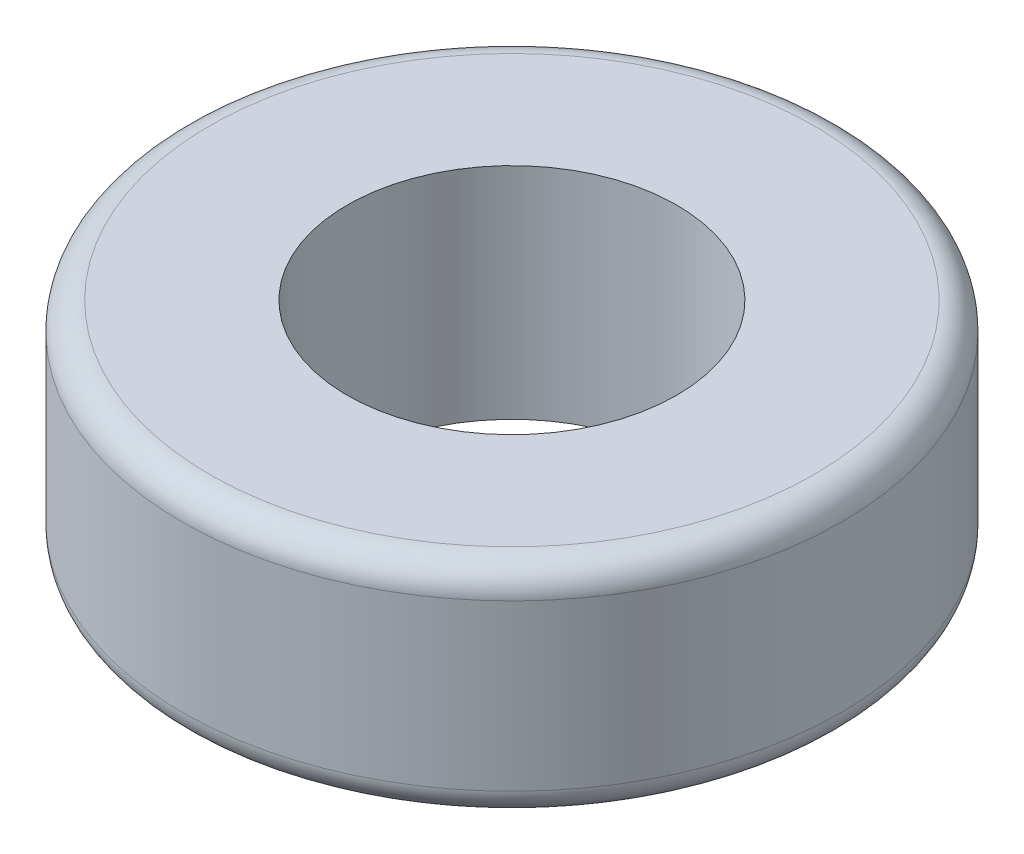
ISO-10303-21;
HEADER;
FILE_DESCRIPTION(('STEP AP214'),'2;1');
FILE_NAME('part.step','',(''),(''),'','','');
FILE_SCHEMA(('AUTOMOTIVE_DESIGN { 1 0 10303 214 1 1 1 1 }'));
ENDSEC;
DATA;
#1=APPLICATION_CONTEXT('core data for automotive mechanical design processes');
#2=APPLICATION_PROTOCOL_DEFINITION('international standard','automotive_design',2000,#1);
#3=PRODUCT_CONTEXT('',#1,'mechanical');
#4=PRODUCT('Part','Part','',(#3));
#5=PRODUCT_RELATED_PRODUCT_CATEGORY('part','',(#4));
#6=PRODUCT_DEFINITION_FORMATION('','',#4);
#7=PRODUCT_DEFINITION_CONTEXT('part definition',#1,'design');
#8=PRODUCT_DEFINITION('design','',#6,#7);
#9=PRODUCT_DEFINITION_SHAPE('','',#8);
#10=(LENGTH_UNIT() NAMED_UNIT(*) SI_UNIT(.MILLI.,.METRE.));
#11=(NAMED_UNIT(*) PLANE_ANGLE_UNIT() SI_UNIT($,.RADIAN.));
#12=(NAMED_UNIT(*) SI_UNIT($,.STERADIAN.) SOLID_ANGLE_UNIT());
#13=UNCERTAINTY_MEASURE_WITH_UNIT(LENGTH_MEASURE(1.E-05),#10,'distance_accuracy_value','');
#14=(GEOMETRIC_REPRESENTATION_CONTEXT(3) GLOBAL_UNCERTAINTY_ASSIGNED_CONTEXT((#13)) GLOBAL_UNIT_ASSIGNED_CONTEXT((#10,
#11,#12)) REPRESENTATION_CONTEXT('',''));
#15=CARTESIAN_POINT('',(0.,0.,0.));
#16=DIRECTION('',(0.,0.,1.));
#17=DIRECTION('',(1.,0.,0.));
#18=AXIS2_PLACEMENT_3D('',#15,#16,#17);
#19=CARTESIAN_POINT('',(13.75,5.00000000000001,0.));
#20=DIRECTION('',(0.,1.,0.));
#21=DIRECTION('',(-1.,0.,0.));
#22=AXIS2_PLACEMENT_3D('',#19,#20,#21);
#23=PLANE('',#22);
#24=CARTESIAN_POINT('',(0.,5.,0.));
#25=DIRECTION('',(0.,-1.,0.));
#26=DIRECTION('',(1.,0.,0.));
#27=AXIS2_PLACEMENT_3D('',#24,#25,#26);
#28=CIRCLE('',#27,7.50000000000002);
#29=CARTESIAN_POINT('',(7.5,5.00000000000003,0.));
#30=VERTEX_POINT('',#29);
#31=EDGE_CURVE('E10',#30,#30,#28,.T.);
#32=ORIENTED_EDGE('',*,*,#31,.T.);
#33=EDGE_LOOP('',(#32));
#34=FACE_BOUND('',#33,.T.);
#35=CARTESIAN_POINT('',(0.,4.99999999999995,0.));
#36=DIRECTION('',(0.,-1.,0.));
#37=DIRECTION('',(1.,0.,0.));
#38=AXIS2_PLACEMENT_3D('',#35,#36,#37);
#39=CIRCLE('',#38,13.75);
#40=CARTESIAN_POINT('',(13.75,5.,0.));
#41=VERTEX_POINT('',#40);
#42=EDGE_CURVE('E57',#41,#41,#39,.T.);
#43=ORIENTED_EDGE('',*,*,#42,.F.);
#44=EDGE_LOOP('',(#43));
#45=FACE_BOUND('',#44,.T.);
#46=ADVANCED_FACE('F34',(#34,#45),#23,.T.);
#47=CARTESIAN_POINT('',(1.18829503014473E-12,-346.416551839449,0.));
#48=DIRECTION('',(0.,-1.,0.));
#49=DIRECTION('',(1.,0.,0.));
#50=AXIS2_PLACEMENT_3D('',#47,#48,#49);
#51=CYLINDRICAL_SURFACE('',#50,7.5);
#52=CARTESIAN_POINT('',(0.,-5.,0.));
#53=DIRECTION('',(0.,-1.,0.));
#54=DIRECTION('',(1.,0.,0.));
#55=AXIS2_PLACEMENT_3D('',#52,#53,#54);
#56=CIRCLE('',#55,7.49999999999998);
#57=CARTESIAN_POINT('',(7.5,-4.99999999999998,0.));
#58=VERTEX_POINT('',#57);
#59=EDGE_CURVE('E41',#58,#58,#56,.T.);
#60=ORIENTED_EDGE('',*,*,#59,.T.);
#61=EDGE_LOOP('',(#60));
#62=FACE_BOUND('',#61,.T.);
#63=ORIENTED_EDGE('',*,*,#31,.F.);
#64=EDGE_LOOP('',(#63));
#65=FACE_BOUND('',#64,.T.);
#66=ADVANCED_FACE('F113',(#62,#65),#51,.F.);
#67=CARTESIAN_POINT('',(7.5,-5.00000000000001,0.));
#68=DIRECTION('',(0.,-1.,0.));
#69=DIRECTION('',(1.,0.,0.));
#70=AXIS2_PLACEMENT_3D('',#67,#68,#69);
#71=PLANE('',#70);
#72=CARTESIAN_POINT('',(0.,-5.00000000000006,0.));
#73=DIRECTION('',(0.,-1.,0.));
#74=DIRECTION('',(1.,0.,0.));
#75=AXIS2_PLACEMENT_3D('',#72,#73,#74);
#76=CIRCLE('',#75,13.75);
#77=CARTESIAN_POINT('',(13.75,-5.00000000000001,0.));
#78=VERTEX_POINT('',#77);
#79=EDGE_CURVE('E45',#78,#78,#76,.T.);
#80=ORIENTED_EDGE('',*,*,#79,.T.);
#81=EDGE_LOOP('',(#80));
#82=FACE_BOUND('',#81,.T.);
#83=ORIENTED_EDGE('',*,*,#59,.F.);
#84=EDGE_LOOP('',(#83));
#85=FACE_BOUND('',#84,.T.);
#86=ADVANCED_FACE('F110',(#82,#85),#71,.T.);
#87=CARTESIAN_POINT('',(0.,-3.75000000000006,0.));
#88=DIRECTION('',(0.,-1.,0.));
#89=DIRECTION('',(1.,0.,0.));
#90=AXIS2_PLACEMENT_3D('',#87,#88,#89);
#91=TOROIDAL_SURFACE('',#90,13.75,1.25);
#92=CARTESIAN_POINT('',(0.,-3.75000000000003,0.));
#93=DIRECTION('',(0.,-1.,0.));
#94=DIRECTION('',(1.,0.,0.));
#95=AXIS2_PLACEMENT_3D('',#92,#93,#94);
#96=CIRCLE('',#95,15.);
#97=CARTESIAN_POINT('',(15.,-3.74999999999998,0.));
#98=VERTEX_POINT('',#97);
#99=EDGE_CURVE('E49',#98,#98,#96,.T.);
#100=ORIENTED_EDGE('',*,*,#99,.T.);
#101=EDGE_LOOP('',(#100));
#102=FACE_BOUND('',#101,.T.);
#103=ORIENTED_EDGE('',*,*,#79,.F.);
#104=EDGE_LOOP('',(#103));
#105=FACE_BOUND('',#104,.T.);
#106=ADVANCED_FACE('F106',(#102,#105),#91,.T.);
#107=CARTESIAN_POINT('',(1.18829503014473E-12,-346.416551839449,0.));
#108=DIRECTION('',(0.,-1.,0.));
#109=DIRECTION('',(1.,0.,0.));
#110=AXIS2_PLACEMENT_3D('',#107,#108,#109);
#111=CYLINDRICAL_SURFACE('',#110,15.);
#112=CARTESIAN_POINT('',(0.,3.74999999999992,0.));
#113=DIRECTION('',(0.,-1.,0.));
#114=DIRECTION('',(1.,0.,0.));
#115=AXIS2_PLACEMENT_3D('',#112,#113,#114);
#116=CIRCLE('',#115,15.);
#117=CARTESIAN_POINT('',(15.,3.74999999999997,0.));
#118=VERTEX_POINT('',#117);
#119=EDGE_CURVE('E54',#118,#118,#116,.T.);
#120=ORIENTED_EDGE('',*,*,#119,.T.);
#121=EDGE_LOOP('',(#120));
#122=FACE_BOUND('',#121,.T.);
#123=ORIENTED_EDGE('',*,*,#99,.F.);
#124=EDGE_LOOP('',(#123));
#125=FACE_BOUND('',#124,.T.);
#126=ADVANCED_FACE('F102',(#122,#125),#111,.T.);
#127=CARTESIAN_POINT('',(0.,3.74999999999994,0.));
#128=DIRECTION('',(0.,-1.,0.));
#129=DIRECTION('',(1.,0.,0.));
#130=AXIS2_PLACEMENT_3D('',#127,#128,#129);
#131=TOROIDAL_SURFACE('',#130,13.75,1.25);
#132=ORIENTED_EDGE('',*,*,#42,.T.);
#133=EDGE_LOOP('',(#132));
#134=FACE_BOUND('',#133,.T.);
#135=ORIENTED_EDGE('',*,*,#119,.F.);
#136=EDGE_LOOP('',(#135));
#137=FACE_BOUND('',#136,.T.);
#138=ADVANCED_FACE('F99',(#134,#137),#131,.T.);
#139=CLOSED_SHELL('',(#46,#66,#86,#106,#126,#138));
#140=CARTESIAN_POINT('',(1.18829503014473E-12,-346.416551839449,0.));
#141=DIRECTION('',(0.,-1.,0.));
#142=DIRECTION('',(1.,0.,0.));
#143=AXIS2_PLACEMENT_3D('',#140,#141,#142);
#144=CYLINDRICAL_SURFACE('',#143,13.5);
#145=CARTESIAN_POINT('',(0.,3.49999999999995,0.));
#146=DIRECTION('',(0.,-1.,0.));
#147=DIRECTION('',(1.,0.,0.));
#148=AXIS2_PLACEMENT_3D('',#145,#146,#147);
#149=CIRCLE('',#148,13.5);
#150=CARTESIAN_POINT('',(13.5,3.49999999999999,0.));
#151=VERTEX_POINT('',#150);
#152=EDGE_CURVE('E69',#151,#151,#149,.T.);
#153=ORIENTED_EDGE('',*,*,#152,.F.);
#154=EDGE_LOOP('',(#153));
#155=FACE_BOUND('',#154,.T.);
#156=CARTESIAN_POINT('',(0.,-3.50000000000006,0.));
#157=DIRECTION('',(0.,-1.,0.));
#158=DIRECTION('',(1.,0.,0.));
#159=AXIS2_PLACEMENT_3D('',#156,#157,#158);
#160=CIRCLE('',#159,13.5);
#161=CARTESIAN_POINT('',(13.5,-3.50000000000001,0.));
#162=VERTEX_POINT('',#161);
#163=EDGE_CURVE('E60',#162,#162,#160,.T.);
#164=ORIENTED_EDGE('',*,*,#163,.T.);
#165=EDGE_LOOP('',(#164));
#166=FACE_BOUND('',#165,.T.);
#167=ADVANCED_FACE('F75',(#155,#166),#144,.F.);
#168=CARTESIAN_POINT('',(9.,-3.50000000000001,0.));
#169=DIRECTION('',(0.,-1.,0.));
#170=DIRECTION('',(1.,0.,0.));
#171=AXIS2_PLACEMENT_3D('',#168,#169,#170);
#172=PLANE('',#171);
#173=ORIENTED_EDGE('',*,*,#163,.F.);
#174=EDGE_LOOP('',(#173));
#175=FACE_BOUND('',#174,.T.);
#176=CARTESIAN_POINT('',(0.,-3.50000000000006,0.));
#177=DIRECTION('',(0.,-1.,0.));
#178=DIRECTION('',(1.,0.,0.));
#179=AXIS2_PLACEMENT_3D('',#176,#177,#178);
#180=CIRCLE('',#179,8.99999999999999);
#181=CARTESIAN_POINT('',(9.,-3.50000000000003,0.));
#182=VERTEX_POINT('',#181);
#183=EDGE_CURVE('E63',#182,#182,#180,.T.);
#184=ORIENTED_EDGE('',*,*,#183,.T.);
#185=EDGE_LOOP('',(#184));
#186=FACE_BOUND('',#185,.T.);
#187=ADVANCED_FACE('F78',(#175,#186),#172,.F.);
#188=CARTESIAN_POINT('',(1.18829503014473E-12,-346.416551839449,0.));
#189=DIRECTION('',(0.,-1.,0.));
#190=DIRECTION('',(1.,0.,0.));
#191=AXIS2_PLACEMENT_3D('',#188,#189,#190);
#192=CYLINDRICAL_SURFACE('',#191,9.);
#193=ORIENTED_EDGE('',*,*,#183,.F.);
#194=EDGE_LOOP('',(#193));
#195=FACE_BOUND('',#194,.T.);
#196=CARTESIAN_POINT('',(0.,3.49999999999995,0.));
#197=DIRECTION('',(0.,-1.,0.));
#198=DIRECTION('',(1.,0.,0.));
#199=AXIS2_PLACEMENT_3D('',#196,#197,#198);
#200=CIRCLE('',#199,9.00000000000001);
#201=CARTESIAN_POINT('',(9.,3.49999999999998,0.));
#202=VERTEX_POINT('',#201);
#203=EDGE_CURVE('E66',#202,#202,#200,.T.);
#204=ORIENTED_EDGE('',*,*,#203,.T.);
#205=EDGE_LOOP('',(#204));
#206=FACE_BOUND('',#205,.T.);
#207=ADVANCED_FACE('F85',(#195,#206),#192,.T.);
#208=CARTESIAN_POINT('',(13.5,3.50000000000001,0.));
#209=DIRECTION('',(0.,1.,0.));
#210=DIRECTION('',(-1.,0.,0.));
#211=AXIS2_PLACEMENT_3D('',#208,#209,#210);
#212=PLANE('',#211);
#213=ORIENTED_EDGE('',*,*,#203,.F.);
#214=EDGE_LOOP('',(#213));
#215=FACE_BOUND('',#214,.T.);
#216=ORIENTED_EDGE('',*,*,#152,.T.);
#217=EDGE_LOOP('',(#216));
#218=FACE_BOUND('',#217,.T.);
#219=ADVANCED_FACE('F73',(#215,#218),#212,.F.);
#220=CLOSED_SHELL('',(#167,#187,#207,#219));
#221=ORIENTED_CLOSED_SHELL('',*,#220,.T.);
#222=BREP_WITH_VOIDS('B2',#139,(#221));
#223=ADVANCED_BREP_SHAPE_REPRESENTATION('',(#18,#222),#14);
#224=SHAPE_DEFINITION_REPRESENTATION(#9,#223);
ENDSEC;
END-ISO-10303-21;
